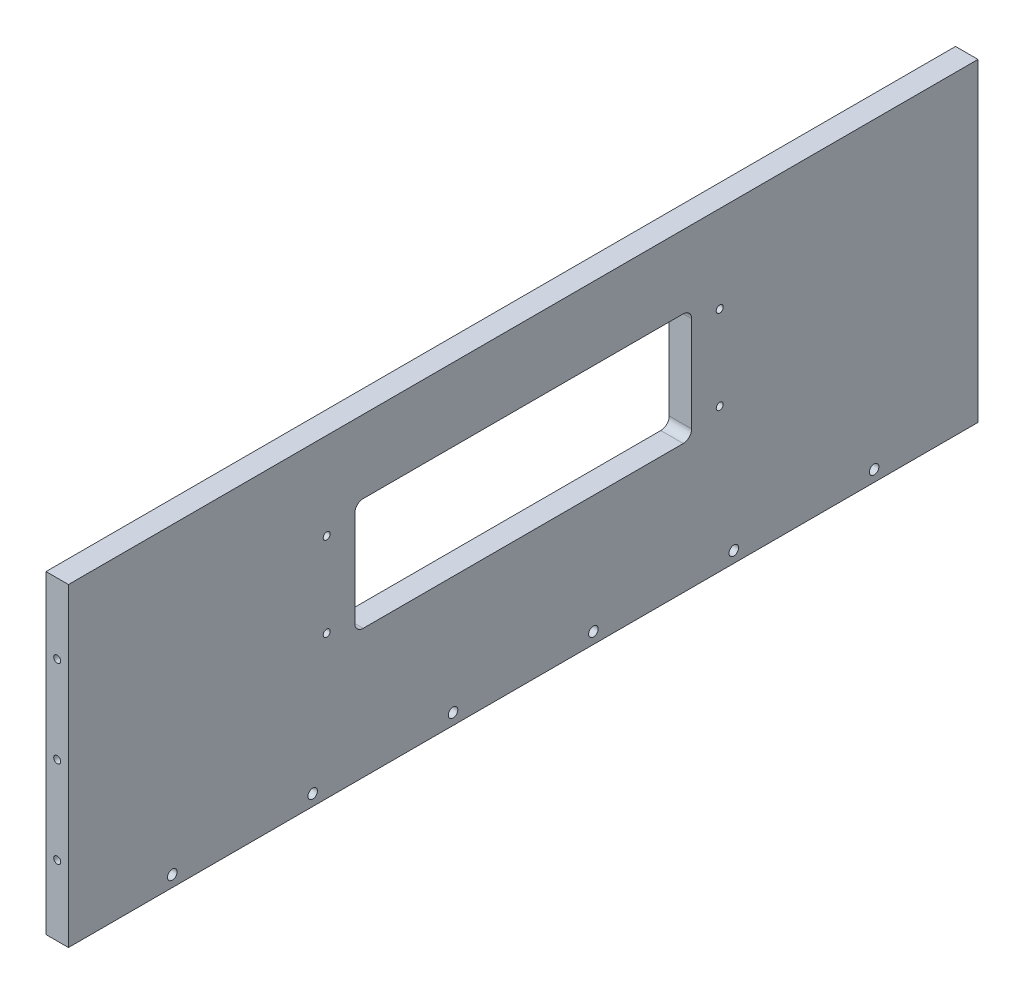
ISO-10303-21;
HEADER;
FILE_DESCRIPTION(('STEP AP214'),'2;1');
FILE_NAME('part.step','',(''),(''),'','','');
FILE_SCHEMA(('AUTOMOTIVE_DESIGN { 1 0 10303 214 1 1 1 1 }'));
ENDSEC;
DATA;
#1=APPLICATION_CONTEXT('core data for automotive mechanical design processes');
#2=APPLICATION_PROTOCOL_DEFINITION('international standard','automotive_design',2000,#1);
#3=PRODUCT_CONTEXT('',#1,'mechanical');
#4=PRODUCT('Part','Part','',(#3));
#5=PRODUCT_RELATED_PRODUCT_CATEGORY('part','',(#4));
#6=PRODUCT_DEFINITION_FORMATION('','',#4);
#7=PRODUCT_DEFINITION_CONTEXT('part definition',#1,'design');
#8=PRODUCT_DEFINITION('design','',#6,#7);
#9=PRODUCT_DEFINITION_SHAPE('','',#8);
#10=(LENGTH_UNIT() NAMED_UNIT(*) SI_UNIT(.MILLI.,.METRE.));
#11=(NAMED_UNIT(*) PLANE_ANGLE_UNIT() SI_UNIT($,.RADIAN.));
#12=(NAMED_UNIT(*) SI_UNIT($,.STERADIAN.) SOLID_ANGLE_UNIT());
#13=UNCERTAINTY_MEASURE_WITH_UNIT(LENGTH_MEASURE(1.E-05),#10,'distance_accuracy_value','');
#14=(GEOMETRIC_REPRESENTATION_CONTEXT(3) GLOBAL_UNCERTAINTY_ASSIGNED_CONTEXT((#13)) GLOBAL_UNIT_ASSIGNED_CONTEXT((#10,
#11,#12)) REPRESENTATION_CONTEXT('',''));
#15=CARTESIAN_POINT('',(0.,0.,0.));
#16=DIRECTION('',(0.,0.,1.));
#17=DIRECTION('',(1.,0.,0.));
#18=AXIS2_PLACEMENT_3D('',#15,#16,#17);
#19=CARTESIAN_POINT('',(8.,-56.,162.));
#20=DIRECTION('',(0.,0.,-1.));
#21=DIRECTION('',(-1.,0.,0.));
#22=AXIS2_PLACEMENT_3D('',#19,#20,#21);
#23=PLANE('',#22);
#24=CARTESIAN_POINT('',(4.00000000000006,31.,162.));
#25=DIRECTION('',(0.,0.,1.));
#26=DIRECTION('',(1.,0.,0.));
#27=AXIS2_PLACEMENT_3D('',#24,#25,#26);
#28=CIRCLE('',#27,1.24999999999999);
#29=CARTESIAN_POINT('',(5.25000000000005,31.,162.));
#30=VERTEX_POINT('',#29);
#31=EDGE_CURVE('E171',#30,#30,#28,.T.);
#32=ORIENTED_EDGE('',*,*,#31,.F.);
#33=EDGE_LOOP('',(#32));
#34=FACE_BOUND('',#33,.T.);
#35=CARTESIAN_POINT('',(4.00000000000006,0.,162.));
#36=DIRECTION('',(0.,0.,1.));
#37=DIRECTION('',(1.,0.,0.));
#38=AXIS2_PLACEMENT_3D('',#35,#36,#37);
#39=CIRCLE('',#38,1.24999999999999);
#40=CARTESIAN_POINT('',(5.25000000000005,0.,162.));
#41=VERTEX_POINT('',#40);
#42=EDGE_CURVE('E177',#41,#41,#39,.T.);
#43=ORIENTED_EDGE('',*,*,#42,.F.);
#44=EDGE_LOOP('',(#43));
#45=FACE_BOUND('',#44,.T.);
#46=CARTESIAN_POINT('',(4.00000000000006,-31.,162.));
#47=DIRECTION('',(0.,0.,1.));
#48=DIRECTION('',(1.,0.,0.));
#49=AXIS2_PLACEMENT_3D('',#46,#47,#48);
#50=CIRCLE('',#49,1.24999999999999);
#51=CARTESIAN_POINT('',(5.25000000000005,-31.,162.));
#52=VERTEX_POINT('',#51);
#53=EDGE_CURVE('E183',#52,#52,#50,.T.);
#54=ORIENTED_EDGE('',*,*,#53,.F.);
#55=EDGE_LOOP('',(#54));
#56=FACE_BOUND('',#55,.T.);
#57=DIRECTION('',(0.,-1.,0.));
#58=VECTOR('',#57,1.);
#59=CARTESIAN_POINT('',(0.,-56.,162.));
#60=LINE('',#59,#58);
#61=CARTESIAN_POINT('',(0.,56.,162.));
#62=VERTEX_POINT('',#61);
#63=CARTESIAN_POINT('',(0.,-56.,162.));
#64=VERTEX_POINT('',#63);
#65=EDGE_CURVE('E189',#62,#64,#60,.T.);
#66=ORIENTED_EDGE('',*,*,#65,.T.);
#67=DIRECTION('',(-1.,0.,0.));
#68=VECTOR('',#67,1.);
#69=CARTESIAN_POINT('',(8.,-56.,162.));
#70=LINE('',#69,#68);
#71=CARTESIAN_POINT('',(8.,-56.,162.));
#72=VERTEX_POINT('',#71);
#73=EDGE_CURVE('E216',#72,#64,#70,.T.);
#74=ORIENTED_EDGE('',*,*,#73,.F.);
#75=DIRECTION('',(0.,-1.,0.));
#76=VECTOR('',#75,1.);
#77=CARTESIAN_POINT('',(8.,-56.,162.));
#78=LINE('',#77,#76);
#79=CARTESIAN_POINT('',(8.,56.,162.));
#80=VERTEX_POINT('',#79);
#81=EDGE_CURVE('E190',#80,#72,#78,.T.);
#82=ORIENTED_EDGE('',*,*,#81,.F.);
#83=DIRECTION('',(-1.,0.,0.));
#84=VECTOR('',#83,1.);
#85=CARTESIAN_POINT('',(8.,56.,162.));
#86=LINE('',#85,#84);
#87=EDGE_CURVE('E200',#80,#62,#86,.T.);
#88=ORIENTED_EDGE('',*,*,#87,.T.);
#89=EDGE_LOOP('',(#66,#74,#82,#88));
#90=FACE_BOUND('',#89,.T.);
#91=ADVANCED_FACE('F37',(#34,#45,#56,#90),#23,.F.);
#92=CARTESIAN_POINT('',(8.,-56.,-162.));
#93=DIRECTION('',(0.,1.,0.));
#94=DIRECTION('',(0.,0.,1.));
#95=AXIS2_PLACEMENT_3D('',#92,#93,#94);
#96=PLANE('',#95);
#97=DIRECTION('',(0.,0.,-1.));
#98=VECTOR('',#97,1.);
#99=CARTESIAN_POINT('',(0.,-56.,-162.));
#100=LINE('',#99,#98);
#101=CARTESIAN_POINT('',(0.,-56.,-162.));
#102=VERTEX_POINT('',#101);
#103=EDGE_CURVE('E203',#64,#102,#100,.T.);
#104=ORIENTED_EDGE('',*,*,#103,.T.);
#105=DIRECTION('',(-1.,0.,0.));
#106=VECTOR('',#105,1.);
#107=CARTESIAN_POINT('',(8.,-56.,-162.));
#108=LINE('',#107,#106);
#109=CARTESIAN_POINT('',(8.,-56.,-162.));
#110=VERTEX_POINT('',#109);
#111=EDGE_CURVE('E213',#110,#102,#108,.T.);
#112=ORIENTED_EDGE('',*,*,#111,.F.);
#113=DIRECTION('',(0.,0.,-1.));
#114=VECTOR('',#113,1.);
#115=CARTESIAN_POINT('',(8.,-56.,-162.));
#116=LINE('',#115,#114);
#117=EDGE_CURVE('E193',#72,#110,#116,.T.);
#118=ORIENTED_EDGE('',*,*,#117,.F.);
#119=ORIENTED_EDGE('',*,*,#73,.T.);
#120=EDGE_LOOP('',(#104,#112,#118,#119));
#121=FACE_BOUND('',#120,.T.);
#122=ADVANCED_FACE('F368',(#121),#96,.F.);
#123=CARTESIAN_POINT('',(8.,-56.,-162.));
#124=DIRECTION('',(0.,0.,1.));
#125=DIRECTION('',(1.,0.,0.));
#126=AXIS2_PLACEMENT_3D('',#123,#124,#125);
#127=PLANE('',#126);
#128=CARTESIAN_POINT('',(4.00000000000006,31.,-162.));
#129=DIRECTION('',(0.,0.,-1.));
#130=DIRECTION('',(-1.,0.,0.));
#131=AXIS2_PLACEMENT_3D('',#128,#129,#130);
#132=CIRCLE('',#131,1.24999999999999);
#133=CARTESIAN_POINT('',(2.75000000000007,31.,-162.));
#134=VERTEX_POINT('',#133);
#135=EDGE_CURVE('E153',#134,#134,#132,.T.);
#136=ORIENTED_EDGE('',*,*,#135,.F.);
#137=EDGE_LOOP('',(#136));
#138=FACE_BOUND('',#137,.T.);
#139=CARTESIAN_POINT('',(4.00000000000006,0.,-162.));
#140=DIRECTION('',(0.,0.,-1.));
#141=DIRECTION('',(-1.,0.,0.));
#142=AXIS2_PLACEMENT_3D('',#139,#140,#141);
#143=CIRCLE('',#142,1.24999999999999);
#144=CARTESIAN_POINT('',(2.75000000000007,0.,-162.));
#145=VERTEX_POINT('',#144);
#146=EDGE_CURVE('E152',#145,#145,#143,.T.);
#147=ORIENTED_EDGE('',*,*,#146,.F.);
#148=EDGE_LOOP('',(#147));
#149=FACE_BOUND('',#148,.T.);
#150=CARTESIAN_POINT('',(4.00000000000006,-31.,-162.));
#151=DIRECTION('',(0.,0.,-1.));
#152=DIRECTION('',(-1.,0.,0.));
#153=AXIS2_PLACEMENT_3D('',#150,#151,#152);
#154=CIRCLE('',#153,1.24999999999999);
#155=CARTESIAN_POINT('',(2.75000000000007,-31.,-162.));
#156=VERTEX_POINT('',#155);
#157=EDGE_CURVE('E165',#156,#156,#154,.T.);
#158=ORIENTED_EDGE('',*,*,#157,.F.);
#159=EDGE_LOOP('',(#158));
#160=FACE_BOUND('',#159,.T.);
#161=DIRECTION('',(0.,1.,0.));
#162=VECTOR('',#161,1.);
#163=CARTESIAN_POINT('',(0.,-56.,-162.));
#164=LINE('',#163,#162);
#165=CARTESIAN_POINT('',(0.,56.,-162.));
#166=VERTEX_POINT('',#165);
#167=EDGE_CURVE('E205',#102,#166,#164,.T.);
#168=ORIENTED_EDGE('',*,*,#167,.T.);
#169=DIRECTION('',(-1.,0.,0.));
#170=VECTOR('',#169,1.);
#171=CARTESIAN_POINT('',(8.,56.,-162.));
#172=LINE('',#171,#170);
#173=CARTESIAN_POINT('',(8.,56.,-162.));
#174=VERTEX_POINT('',#173);
#175=EDGE_CURVE('E210',#174,#166,#172,.T.);
#176=ORIENTED_EDGE('',*,*,#175,.F.);
#177=DIRECTION('',(0.,1.,0.));
#178=VECTOR('',#177,1.);
#179=CARTESIAN_POINT('',(8.,-56.,-162.));
#180=LINE('',#179,#178);
#181=EDGE_CURVE('E196',#110,#174,#180,.T.);
#182=ORIENTED_EDGE('',*,*,#181,.F.);
#183=ORIENTED_EDGE('',*,*,#111,.T.);
#184=EDGE_LOOP('',(#168,#176,#182,#183));
#185=FACE_BOUND('',#184,.T.);
#186=ADVANCED_FACE('F365',(#138,#149,#160,#185),#127,.F.);
#187=CARTESIAN_POINT('',(8.,56.,-162.));
#188=DIRECTION('',(0.,-1.,0.));
#189=DIRECTION('',(0.,0.,-1.));
#190=AXIS2_PLACEMENT_3D('',#187,#188,#189);
#191=PLANE('',#190);
#192=DIRECTION('',(0.,0.,1.));
#193=VECTOR('',#192,1.);
#194=CARTESIAN_POINT('',(0.,56.,-162.));
#195=LINE('',#194,#193);
#196=EDGE_CURVE('E194',#166,#62,#195,.T.);
#197=ORIENTED_EDGE('',*,*,#196,.T.);
#198=ORIENTED_EDGE('',*,*,#87,.F.);
#199=DIRECTION('',(0.,0.,1.));
#200=VECTOR('',#199,1.);
#201=CARTESIAN_POINT('',(8.,56.,-162.));
#202=LINE('',#201,#200);
#203=EDGE_CURVE('E198',#174,#80,#202,.T.);
#204=ORIENTED_EDGE('',*,*,#203,.F.);
#205=ORIENTED_EDGE('',*,*,#175,.T.);
#206=EDGE_LOOP('',(#197,#198,#204,#205));
#207=FACE_BOUND('',#206,.T.);
#208=ADVANCED_FACE('F361',(#207),#191,.F.);
#209=CARTESIAN_POINT('',(8.,0.,0.));
#210=DIRECTION('',(1.,0.,0.));
#211=DIRECTION('',(0.,0.,-1.));
#212=AXIS2_PLACEMENT_3D('',#209,#210,#211);
#213=PLANE('',#212);
#214=CARTESIAN_POINT('',(8.,25.,-70.));
#215=DIRECTION('',(1.,0.,0.));
#216=DIRECTION('',(0.,0.,-1.));
#217=AXIS2_PLACEMENT_3D('',#214,#215,#216);
#218=CIRCLE('',#217,1.24999999999999);
#219=CARTESIAN_POINT('',(8.,25.,-71.25));
#220=VERTEX_POINT('',#219);
#221=EDGE_CURVE('E436',#220,#220,#218,.T.);
#222=ORIENTED_EDGE('',*,*,#221,.F.);
#223=EDGE_LOOP('',(#222));
#224=FACE_BOUND('',#223,.T.);
#225=CARTESIAN_POINT('',(8.,-5.,-70.));
#226=DIRECTION('',(1.,0.,0.));
#227=DIRECTION('',(0.,0.,-1.));
#228=AXIS2_PLACEMENT_3D('',#225,#226,#227);
#229=CIRCLE('',#228,1.24999999999999);
#230=CARTESIAN_POINT('',(8.,-5.,-71.25));
#231=VERTEX_POINT('',#230);
#232=EDGE_CURVE('E430',#231,#231,#229,.T.);
#233=ORIENTED_EDGE('',*,*,#232,.F.);
#234=EDGE_LOOP('',(#233));
#235=FACE_BOUND('',#234,.T.);
#236=CARTESIAN_POINT('',(8.,25.,70.));
#237=DIRECTION('',(1.,0.,0.));
#238=DIRECTION('',(0.,0.,-1.));
#239=AXIS2_PLACEMENT_3D('',#236,#237,#238);
#240=CIRCLE('',#239,1.24999999999999);
#241=CARTESIAN_POINT('',(8.,25.,68.75));
#242=VERTEX_POINT('',#241);
#243=EDGE_CURVE('E424',#242,#242,#240,.T.);
#244=ORIENTED_EDGE('',*,*,#243,.F.);
#245=EDGE_LOOP('',(#244));
#246=FACE_BOUND('',#245,.T.);
#247=CARTESIAN_POINT('',(8.,-5.,70.));
#248=DIRECTION('',(1.,0.,0.));
#249=DIRECTION('',(0.,0.,-1.));
#250=AXIS2_PLACEMENT_3D('',#247,#248,#249);
#251=CIRCLE('',#250,1.24999999999999);
#252=CARTESIAN_POINT('',(8.,-5.,68.75));
#253=VERTEX_POINT('',#252);
#254=EDGE_CURVE('E418',#253,#253,#251,.T.);
#255=ORIENTED_EDGE('',*,*,#254,.F.);
#256=EDGE_LOOP('',(#255));
#257=FACE_BOUND('',#256,.T.);
#258=DIRECTION('',(0.,-1.,0.));
#259=VECTOR('',#258,1.);
#260=CARTESIAN_POINT('',(8.,-10.,60.));
#261=LINE('',#260,#259);
#262=CARTESIAN_POINT('',(8.,27.,60.));
#263=VERTEX_POINT('',#262);
#264=CARTESIAN_POINT('',(8.,-7.,60.));
#265=VERTEX_POINT('',#264);
#266=EDGE_CURVE('E307',#263,#265,#261,.T.);
#267=ORIENTED_EDGE('',*,*,#266,.F.);
#268=CARTESIAN_POINT('',(8.,27.,57.));
#269=DIRECTION('',(1.,0.,0.));
#270=DIRECTION('',(0.,0.,-1.));
#271=AXIS2_PLACEMENT_3D('',#268,#269,#270);
#272=CIRCLE('',#271,3.);
#273=CARTESIAN_POINT('',(8.,30.,57.));
#274=VERTEX_POINT('',#273);
#275=EDGE_CURVE('E274',#263,#274,#272,.F.);
#276=ORIENTED_EDGE('',*,*,#275,.T.);
#277=DIRECTION('',(0.,0.,1.));
#278=VECTOR('',#277,1.);
#279=CARTESIAN_POINT('',(8.,30.,-60.));
#280=LINE('',#279,#278);
#281=CARTESIAN_POINT('',(8.,30.,-57.));
#282=VERTEX_POINT('',#281);
#283=EDGE_CURVE('E285',#282,#274,#280,.T.);
#284=ORIENTED_EDGE('',*,*,#283,.F.);
#285=CARTESIAN_POINT('',(8.,27.,-57.));
#286=DIRECTION('',(1.,0.,0.));
#287=DIRECTION('',(0.,0.,-1.));
#288=AXIS2_PLACEMENT_3D('',#285,#286,#287);
#289=CIRCLE('',#288,3.);
#290=CARTESIAN_POINT('',(8.,27.,-60.));
#291=VERTEX_POINT('',#290);
#292=EDGE_CURVE('E45',#282,#291,#289,.F.);
#293=ORIENTED_EDGE('',*,*,#292,.T.);
#294=DIRECTION('',(0.,1.,0.));
#295=VECTOR('',#294,1.);
#296=CARTESIAN_POINT('',(8.,-9.99999999999999,-60.));
#297=LINE('',#296,#295);
#298=CARTESIAN_POINT('',(8.,-6.99999999999999,-60.));
#299=VERTEX_POINT('',#298);
#300=EDGE_CURVE('E284',#299,#291,#297,.T.);
#301=ORIENTED_EDGE('',*,*,#300,.F.);
#302=CARTESIAN_POINT('',(8.,-6.99999999999999,-57.));
#303=DIRECTION('',(1.,0.,0.));
#304=DIRECTION('',(0.,0.,-1.));
#305=AXIS2_PLACEMENT_3D('',#302,#303,#304);
#306=CIRCLE('',#305,3.);
#307=CARTESIAN_POINT('',(8.,-9.99999999999999,-57.));
#308=VERTEX_POINT('',#307);
#309=EDGE_CURVE('E266',#299,#308,#306,.F.);
#310=ORIENTED_EDGE('',*,*,#309,.T.);
#311=DIRECTION('',(0.,0.,-1.));
#312=VECTOR('',#311,1.);
#313=CARTESIAN_POINT('',(8.,-9.99999999999999,-60.));
#314=LINE('',#313,#312);
#315=CARTESIAN_POINT('',(8.,-10.,57.));
#316=VERTEX_POINT('',#315);
#317=EDGE_CURVE('E293',#316,#308,#314,.T.);
#318=ORIENTED_EDGE('',*,*,#317,.F.);
#319=CARTESIAN_POINT('',(8.,-7.,57.));
#320=DIRECTION('',(1.,0.,0.));
#321=DIRECTION('',(0.,0.,-1.));
#322=AXIS2_PLACEMENT_3D('',#319,#320,#321);
#323=CIRCLE('',#322,3.);
#324=EDGE_CURVE('E270',#316,#265,#323,.F.);
#325=ORIENTED_EDGE('',*,*,#324,.T.);
#326=EDGE_LOOP('',(#267,#276,#284,#293,#301,#310,#318,#325));
#327=FACE_BOUND('',#326,.T.);
#328=CARTESIAN_POINT('',(8.,-52.,-125.));
#329=DIRECTION('',(1.,0.,0.));
#330=DIRECTION('',(0.,0.,-1.));
#331=AXIS2_PLACEMENT_3D('',#328,#329,#330);
#332=CIRCLE('',#331,1.7);
#333=CARTESIAN_POINT('',(8.,-52.,-126.7));
#334=VERTEX_POINT('',#333);
#335=EDGE_CURVE('E243',#334,#334,#332,.T.);
#336=ORIENTED_EDGE('',*,*,#335,.F.);
#337=EDGE_LOOP('',(#336));
#338=FACE_BOUND('',#337,.T.);
#339=CARTESIAN_POINT('',(8.,-52.,-75.));
#340=DIRECTION('',(1.,0.,0.));
#341=DIRECTION('',(0.,0.,-1.));
#342=AXIS2_PLACEMENT_3D('',#339,#340,#341);
#343=CIRCLE('',#342,1.7);
#344=CARTESIAN_POINT('',(8.,-52.,-76.7));
#345=VERTEX_POINT('',#344);
#346=EDGE_CURVE('E238',#345,#345,#343,.T.);
#347=ORIENTED_EDGE('',*,*,#346,.F.);
#348=EDGE_LOOP('',(#347));
#349=FACE_BOUND('',#348,.T.);
#350=CARTESIAN_POINT('',(8.,-52.,-25.));
#351=DIRECTION('',(1.,0.,0.));
#352=DIRECTION('',(0.,0.,-1.));
#353=AXIS2_PLACEMENT_3D('',#350,#351,#352);
#354=CIRCLE('',#353,1.7);
#355=CARTESIAN_POINT('',(8.,-52.,-26.7));
#356=VERTEX_POINT('',#355);
#357=EDGE_CURVE('E233',#356,#356,#354,.T.);
#358=ORIENTED_EDGE('',*,*,#357,.F.);
#359=EDGE_LOOP('',(#358));
#360=FACE_BOUND('',#359,.T.);
#361=CARTESIAN_POINT('',(8.,-52.,25.));
#362=DIRECTION('',(1.,0.,0.));
#363=DIRECTION('',(0.,0.,-1.));
#364=AXIS2_PLACEMENT_3D('',#361,#362,#363);
#365=CIRCLE('',#364,1.7);
#366=CARTESIAN_POINT('',(8.,-52.,23.3));
#367=VERTEX_POINT('',#366);
#368=EDGE_CURVE('E228',#367,#367,#365,.T.);
#369=ORIENTED_EDGE('',*,*,#368,.F.);
#370=EDGE_LOOP('',(#369));
#371=FACE_BOUND('',#370,.T.);
#372=CARTESIAN_POINT('',(8.,-51.9999999999999,75.));
#373=DIRECTION('',(1.,0.,0.));
#374=DIRECTION('',(0.,0.,-1.));
#375=AXIS2_PLACEMENT_3D('',#372,#373,#374);
#376=CIRCLE('',#375,1.7);
#377=CARTESIAN_POINT('',(8.,-51.9999999999999,73.3));
#378=VERTEX_POINT('',#377);
#379=EDGE_CURVE('E223',#378,#378,#376,.T.);
#380=ORIENTED_EDGE('',*,*,#379,.F.);
#381=EDGE_LOOP('',(#380));
#382=FACE_BOUND('',#381,.T.);
#383=CARTESIAN_POINT('',(8.,-51.9999999999999,125.));
#384=DIRECTION('',(1.,0.,0.));
#385=DIRECTION('',(0.,0.,-1.));
#386=AXIS2_PLACEMENT_3D('',#383,#384,#385);
#387=CIRCLE('',#386,1.7);
#388=CARTESIAN_POINT('',(8.,-51.9999999999999,123.3));
#389=VERTEX_POINT('',#388);
#390=EDGE_CURVE('E159',#389,#389,#387,.T.);
#391=ORIENTED_EDGE('',*,*,#390,.F.);
#392=EDGE_LOOP('',(#391));
#393=FACE_BOUND('',#392,.T.);
#394=ORIENTED_EDGE('',*,*,#81,.T.);
#395=ORIENTED_EDGE('',*,*,#117,.T.);
#396=ORIENTED_EDGE('',*,*,#181,.T.);
#397=ORIENTED_EDGE('',*,*,#203,.T.);
#398=EDGE_LOOP('',(#394,#395,#396,#397));
#399=FACE_BOUND('',#398,.T.);
#400=ADVANCED_FACE('F282',(#224,#235,#246,#257,#327,#338,#349,#360,#371,#382,#393,#399),#213,.T.);
#401=CARTESIAN_POINT('',(0.,0.,0.));
#402=DIRECTION('',(1.,0.,0.));
#403=DIRECTION('',(0.,0.,-1.));
#404=AXIS2_PLACEMENT_3D('',#401,#402,#403);
#405=PLANE('',#404);
#406=CARTESIAN_POINT('',(0.,25.,-70.));
#407=DIRECTION('',(1.,0.,0.));
#408=DIRECTION('',(0.,0.,-1.));
#409=AXIS2_PLACEMENT_3D('',#406,#407,#408);
#410=CIRCLE('',#409,1.25);
#411=CARTESIAN_POINT('',(0.,25.,-71.25));
#412=VERTEX_POINT('',#411);
#413=EDGE_CURVE('E433',#412,#412,#410,.T.);
#414=ORIENTED_EDGE('',*,*,#413,.T.);
#415=EDGE_LOOP('',(#414));
#416=FACE_BOUND('',#415,.T.);
#417=CARTESIAN_POINT('',(0.,-5.,-70.));
#418=DIRECTION('',(1.,0.,0.));
#419=DIRECTION('',(0.,0.,-1.));
#420=AXIS2_PLACEMENT_3D('',#417,#418,#419);
#421=CIRCLE('',#420,1.25);
#422=CARTESIAN_POINT('',(0.,-5.,-71.25));
#423=VERTEX_POINT('',#422);
#424=EDGE_CURVE('E427',#423,#423,#421,.T.);
#425=ORIENTED_EDGE('',*,*,#424,.T.);
#426=EDGE_LOOP('',(#425));
#427=FACE_BOUND('',#426,.T.);
#428=CARTESIAN_POINT('',(0.,25.,70.));
#429=DIRECTION('',(1.,0.,0.));
#430=DIRECTION('',(0.,0.,-1.));
#431=AXIS2_PLACEMENT_3D('',#428,#429,#430);
#432=CIRCLE('',#431,1.25);
#433=CARTESIAN_POINT('',(0.,25.,68.75));
#434=VERTEX_POINT('',#433);
#435=EDGE_CURVE('E421',#434,#434,#432,.T.);
#436=ORIENTED_EDGE('',*,*,#435,.T.);
#437=EDGE_LOOP('',(#436));
#438=FACE_BOUND('',#437,.T.);
#439=CARTESIAN_POINT('',(0.,-5.,70.));
#440=DIRECTION('',(1.,0.,0.));
#441=DIRECTION('',(0.,0.,-1.));
#442=AXIS2_PLACEMENT_3D('',#439,#440,#441);
#443=CIRCLE('',#442,1.25);
#444=CARTESIAN_POINT('',(0.,-5.,68.75));
#445=VERTEX_POINT('',#444);
#446=EDGE_CURVE('E310',#445,#445,#443,.T.);
#447=ORIENTED_EDGE('',*,*,#446,.T.);
#448=EDGE_LOOP('',(#447));
#449=FACE_BOUND('',#448,.T.);
#450=DIRECTION('',(0.,1.,0.));
#451=VECTOR('',#450,1.);
#452=CARTESIAN_POINT('',(0.,-9.99999999999999,-60.));
#453=LINE('',#452,#451);
#454=CARTESIAN_POINT('',(0.,-6.99999999999999,-60.));
#455=VERTEX_POINT('',#454);
#456=CARTESIAN_POINT('',(0.,27.,-60.));
#457=VERTEX_POINT('',#456);
#458=EDGE_CURVE('E299',#455,#457,#453,.T.);
#459=ORIENTED_EDGE('',*,*,#458,.T.);
#460=CARTESIAN_POINT('',(0.,27.,-57.));
#461=DIRECTION('',(1.,0.,0.));
#462=DIRECTION('',(0.,0.,-1.));
#463=AXIS2_PLACEMENT_3D('',#460,#461,#462);
#464=CIRCLE('',#463,3.);
#465=CARTESIAN_POINT('',(0.,30.,-57.));
#466=VERTEX_POINT('',#465);
#467=EDGE_CURVE('E11',#457,#466,#464,.T.);
#468=ORIENTED_EDGE('',*,*,#467,.T.);
#469=DIRECTION('',(0.,0.,1.));
#470=VECTOR('',#469,1.);
#471=CARTESIAN_POINT('',(0.,30.,-60.));
#472=LINE('',#471,#470);
#473=CARTESIAN_POINT('',(0.,30.,57.));
#474=VERTEX_POINT('',#473);
#475=EDGE_CURVE('E296',#466,#474,#472,.T.);
#476=ORIENTED_EDGE('',*,*,#475,.T.);
#477=CARTESIAN_POINT('',(0.,27.,57.));
#478=DIRECTION('',(1.,0.,0.));
#479=DIRECTION('',(0.,0.,-1.));
#480=AXIS2_PLACEMENT_3D('',#477,#478,#479);
#481=CIRCLE('',#480,3.);
#482=CARTESIAN_POINT('',(0.,27.,60.));
#483=VERTEX_POINT('',#482);
#484=EDGE_CURVE('E276',#474,#483,#481,.T.);
#485=ORIENTED_EDGE('',*,*,#484,.T.);
#486=DIRECTION('',(0.,-1.,0.));
#487=VECTOR('',#486,1.);
#488=CARTESIAN_POINT('',(0.,-10.,60.));
#489=LINE('',#488,#487);
#490=CARTESIAN_POINT('',(0.,-7.,60.));
#491=VERTEX_POINT('',#490);
#492=EDGE_CURVE('E313',#483,#491,#489,.T.);
#493=ORIENTED_EDGE('',*,*,#492,.T.);
#494=CARTESIAN_POINT('',(0.,-7.,57.));
#495=DIRECTION('',(1.,0.,0.));
#496=DIRECTION('',(0.,0.,-1.));
#497=AXIS2_PLACEMENT_3D('',#494,#495,#496);
#498=CIRCLE('',#497,3.);
#499=CARTESIAN_POINT('',(0.,-10.,57.));
#500=VERTEX_POINT('',#499);
#501=EDGE_CURVE('E272',#491,#500,#498,.T.);
#502=ORIENTED_EDGE('',*,*,#501,.T.);
#503=DIRECTION('',(0.,0.,-1.));
#504=VECTOR('',#503,1.);
#505=CARTESIAN_POINT('',(0.,-9.99999999999999,-60.));
#506=LINE('',#505,#504);
#507=CARTESIAN_POINT('',(0.,-9.99999999999999,-57.));
#508=VERTEX_POINT('',#507);
#509=EDGE_CURVE('E303',#500,#508,#506,.T.);
#510=ORIENTED_EDGE('',*,*,#509,.T.);
#511=CARTESIAN_POINT('',(0.,-6.99999999999999,-57.));
#512=DIRECTION('',(1.,0.,0.));
#513=DIRECTION('',(0.,0.,-1.));
#514=AXIS2_PLACEMENT_3D('',#511,#512,#513);
#515=CIRCLE('',#514,3.);
#516=EDGE_CURVE('E268',#508,#455,#515,.T.);
#517=ORIENTED_EDGE('',*,*,#516,.T.);
#518=EDGE_LOOP('',(#459,#468,#476,#485,#493,#502,#510,#517));
#519=FACE_BOUND('',#518,.T.);
#520=CARTESIAN_POINT('',(0.,-52.,-125.));
#521=DIRECTION('',(-1.,0.,0.));
#522=DIRECTION('',(0.,0.,1.));
#523=AXIS2_PLACEMENT_3D('',#520,#521,#522);
#524=CIRCLE('',#523,3.15);
#525=CARTESIAN_POINT('',(0.,-52.,-121.85));
#526=VERTEX_POINT('',#525);
#527=EDGE_CURVE('E298',#526,#526,#524,.T.);
#528=ORIENTED_EDGE('',*,*,#527,.F.);
#529=EDGE_LOOP('',(#528));
#530=FACE_BOUND('',#529,.T.);
#531=CARTESIAN_POINT('',(0.,-52.,-75.));
#532=DIRECTION('',(-1.,0.,0.));
#533=DIRECTION('',(0.,0.,1.));
#534=AXIS2_PLACEMENT_3D('',#531,#532,#533);
#535=CIRCLE('',#534,3.15);
#536=CARTESIAN_POINT('',(0.,-52.,-71.85));
#537=VERTEX_POINT('',#536);
#538=EDGE_CURVE('E246',#537,#537,#535,.T.);
#539=ORIENTED_EDGE('',*,*,#538,.F.);
#540=EDGE_LOOP('',(#539));
#541=FACE_BOUND('',#540,.T.);
#542=CARTESIAN_POINT('',(0.,-52.,-25.));
#543=DIRECTION('',(-1.,0.,0.));
#544=DIRECTION('',(0.,0.,1.));
#545=AXIS2_PLACEMENT_3D('',#542,#543,#544);
#546=CIRCLE('',#545,3.15);
#547=CARTESIAN_POINT('',(0.,-52.,-21.85));
#548=VERTEX_POINT('',#547);
#549=EDGE_CURVE('E241',#548,#548,#546,.T.);
#550=ORIENTED_EDGE('',*,*,#549,.F.);
#551=EDGE_LOOP('',(#550));
#552=FACE_BOUND('',#551,.T.);
#553=CARTESIAN_POINT('',(0.,-52.,25.));
#554=DIRECTION('',(-1.,0.,0.));
#555=DIRECTION('',(0.,0.,1.));
#556=AXIS2_PLACEMENT_3D('',#553,#554,#555);
#557=CIRCLE('',#556,3.15);
#558=CARTESIAN_POINT('',(0.,-52.,28.15));
#559=VERTEX_POINT('',#558);
#560=EDGE_CURVE('E236',#559,#559,#557,.T.);
#561=ORIENTED_EDGE('',*,*,#560,.F.);
#562=EDGE_LOOP('',(#561));
#563=FACE_BOUND('',#562,.T.);
#564=CARTESIAN_POINT('',(0.,-51.9999999999999,75.));
#565=DIRECTION('',(-1.,0.,0.));
#566=DIRECTION('',(0.,0.,1.));
#567=AXIS2_PLACEMENT_3D('',#564,#565,#566);
#568=CIRCLE('',#567,3.15);
#569=CARTESIAN_POINT('',(0.,-51.9999999999999,78.15));
#570=VERTEX_POINT('',#569);
#571=EDGE_CURVE('E231',#570,#570,#568,.T.);
#572=ORIENTED_EDGE('',*,*,#571,.F.);
#573=EDGE_LOOP('',(#572));
#574=FACE_BOUND('',#573,.T.);
#575=CARTESIAN_POINT('',(0.,-51.9999999999999,125.));
#576=DIRECTION('',(-1.,0.,0.));
#577=DIRECTION('',(0.,0.,1.));
#578=AXIS2_PLACEMENT_3D('',#575,#576,#577);
#579=CIRCLE('',#578,3.15);
#580=CARTESIAN_POINT('',(0.,-51.9999999999999,128.15));
#581=VERTEX_POINT('',#580);
#582=EDGE_CURVE('E226',#581,#581,#579,.T.);
#583=ORIENTED_EDGE('',*,*,#582,.F.);
#584=EDGE_LOOP('',(#583));
#585=FACE_BOUND('',#584,.T.);
#586=ORIENTED_EDGE('',*,*,#65,.F.);
#587=ORIENTED_EDGE('',*,*,#196,.F.);
#588=ORIENTED_EDGE('',*,*,#167,.F.);
#589=ORIENTED_EDGE('',*,*,#103,.F.);
#590=EDGE_LOOP('',(#586,#587,#588,#589));
#591=FACE_BOUND('',#590,.T.);
#592=ADVANCED_FACE('F346',(#416,#427,#438,#449,#519,#530,#541,#552,#563,#574,#585,#591),#405,.F.);
#593=CARTESIAN_POINT('',(4.00000000000006,-31.,150.5));
#594=DIRECTION('',(0.,0.,1.));
#595=DIRECTION('',(1.,0.,0.));
#596=AXIS2_PLACEMENT_3D('',#593,#594,#595);
#597=CONICAL_SURFACE('',#596,1.24999999999999,1.02974425867665);
#598=CARTESIAN_POINT('',(4.00000000000006,-31.,149.748924226216));
#599=VERTEX_POINT('',#598);
#600=VERTEX_LOOP('',#599);
#601=FACE_BOUND('',#600,.T.);
#602=CARTESIAN_POINT('',(4.00000000000006,-31.,150.5));
#603=DIRECTION('',(0.,0.,1.));
#604=DIRECTION('',(1.,0.,0.));
#605=AXIS2_PLACEMENT_3D('',#602,#603,#604);
#606=CIRCLE('',#605,1.24999999999999);
#607=CARTESIAN_POINT('',(5.25000000000005,-31.,150.5));
#608=VERTEX_POINT('',#607);
#609=EDGE_CURVE('E186',#608,#608,#606,.T.);
#610=ORIENTED_EDGE('',*,*,#609,.T.);
#611=EDGE_LOOP('',(#610));
#612=FACE_BOUND('',#611,.T.);
#613=ADVANCED_FACE('F349',(#601,#612),#597,.F.);
#614=CARTESIAN_POINT('',(4.00000000000006,-31.,162.));
#615=DIRECTION('',(0.,0.,1.));
#616=DIRECTION('',(1.,0.,0.));
#617=AXIS2_PLACEMENT_3D('',#614,#615,#616);
#618=CYLINDRICAL_SURFACE('',#617,1.24999999999999);
#619=ORIENTED_EDGE('',*,*,#609,.F.);
#620=EDGE_LOOP('',(#619));
#621=FACE_BOUND('',#620,.T.);
#622=ORIENTED_EDGE('',*,*,#53,.T.);
#623=EDGE_LOOP('',(#622));
#624=FACE_BOUND('',#623,.T.);
#625=ADVANCED_FACE('F542',(#621,#624),#618,.F.);
#626=CARTESIAN_POINT('',(4.00000000000006,0.,150.5));
#627=DIRECTION('',(0.,0.,1.));
#628=DIRECTION('',(1.,0.,0.));
#629=AXIS2_PLACEMENT_3D('',#626,#627,#628);
#630=CONICAL_SURFACE('',#629,1.24999999999999,1.02974425867665);
#631=CARTESIAN_POINT('',(4.00000000000006,0.,149.748924226216));
#632=VERTEX_POINT('',#631);
#633=VERTEX_LOOP('',#632);
#634=FACE_BOUND('',#633,.T.);
#635=CARTESIAN_POINT('',(4.00000000000006,0.,150.5));
#636=DIRECTION('',(0.,0.,1.));
#637=DIRECTION('',(1.,0.,0.));
#638=AXIS2_PLACEMENT_3D('',#635,#636,#637);
#639=CIRCLE('',#638,1.24999999999999);
#640=CARTESIAN_POINT('',(5.25000000000005,0.,150.5));
#641=VERTEX_POINT('',#640);
#642=EDGE_CURVE('E180',#641,#641,#639,.T.);
#643=ORIENTED_EDGE('',*,*,#642,.T.);
#644=EDGE_LOOP('',(#643));
#645=FACE_BOUND('',#644,.T.);
#646=ADVANCED_FACE('F538',(#634,#645),#630,.F.);
#647=CARTESIAN_POINT('',(4.00000000000006,0.,162.));
#648=DIRECTION('',(0.,0.,1.));
#649=DIRECTION('',(1.,0.,0.));
#650=AXIS2_PLACEMENT_3D('',#647,#648,#649);
#651=CYLINDRICAL_SURFACE('',#650,1.24999999999999);
#652=ORIENTED_EDGE('',*,*,#642,.F.);
#653=EDGE_LOOP('',(#652));
#654=FACE_BOUND('',#653,.T.);
#655=ORIENTED_EDGE('',*,*,#42,.T.);
#656=EDGE_LOOP('',(#655));
#657=FACE_BOUND('',#656,.T.);
#658=ADVANCED_FACE('F534',(#654,#657),#651,.F.);
#659=CARTESIAN_POINT('',(4.00000000000006,31.,150.5));
#660=DIRECTION('',(0.,0.,1.));
#661=DIRECTION('',(1.,0.,0.));
#662=AXIS2_PLACEMENT_3D('',#659,#660,#661);
#663=CONICAL_SURFACE('',#662,1.24999999999999,1.02974425867665);
#664=CARTESIAN_POINT('',(4.00000000000006,31.,149.748924226216));
#665=VERTEX_POINT('',#664);
#666=VERTEX_LOOP('',#665);
#667=FACE_BOUND('',#666,.T.);
#668=CARTESIAN_POINT('',(4.00000000000006,31.,150.5));
#669=DIRECTION('',(0.,0.,1.));
#670=DIRECTION('',(1.,0.,0.));
#671=AXIS2_PLACEMENT_3D('',#668,#669,#670);
#672=CIRCLE('',#671,1.24999999999999);
#673=CARTESIAN_POINT('',(5.25000000000005,31.,150.5));
#674=VERTEX_POINT('',#673);
#675=EDGE_CURVE('E174',#674,#674,#672,.T.);
#676=ORIENTED_EDGE('',*,*,#675,.T.);
#677=EDGE_LOOP('',(#676));
#678=FACE_BOUND('',#677,.T.);
#679=ADVANCED_FACE('F530',(#667,#678),#663,.F.);
#680=CARTESIAN_POINT('',(4.00000000000006,31.,162.));
#681=DIRECTION('',(0.,0.,1.));
#682=DIRECTION('',(1.,0.,0.));
#683=AXIS2_PLACEMENT_3D('',#680,#681,#682);
#684=CYLINDRICAL_SURFACE('',#683,1.24999999999999);
#685=ORIENTED_EDGE('',*,*,#675,.F.);
#686=EDGE_LOOP('',(#685));
#687=FACE_BOUND('',#686,.T.);
#688=ORIENTED_EDGE('',*,*,#31,.T.);
#689=EDGE_LOOP('',(#688));
#690=FACE_BOUND('',#689,.T.);
#691=ADVANCED_FACE('F526',(#687,#690),#684,.F.);
#692=CARTESIAN_POINT('',(4.00000000000006,-31.,-150.5));
#693=DIRECTION('',(0.,0.,-1.));
#694=DIRECTION('',(-1.,0.,0.));
#695=AXIS2_PLACEMENT_3D('',#692,#693,#694);
#696=CONICAL_SURFACE('',#695,1.24999999999999,1.02974425867665);
#697=CARTESIAN_POINT('',(4.00000000000006,-31.,-149.748924226216));
#698=VERTEX_POINT('',#697);
#699=VERTEX_LOOP('',#698);
#700=FACE_BOUND('',#699,.T.);
#701=CARTESIAN_POINT('',(4.00000000000006,-31.,-150.5));
#702=DIRECTION('',(0.,0.,-1.));
#703=DIRECTION('',(-1.,0.,0.));
#704=AXIS2_PLACEMENT_3D('',#701,#702,#703);
#705=CIRCLE('',#704,1.24999999999999);
#706=CARTESIAN_POINT('',(2.75000000000007,-31.,-150.5));
#707=VERTEX_POINT('',#706);
#708=EDGE_CURVE('E168',#707,#707,#705,.T.);
#709=ORIENTED_EDGE('',*,*,#708,.T.);
#710=EDGE_LOOP('',(#709));
#711=FACE_BOUND('',#710,.T.);
#712=ADVANCED_FACE('F522',(#700,#711),#696,.F.);
#713=CARTESIAN_POINT('',(4.00000000000006,-31.,-162.));
#714=DIRECTION('',(0.,0.,-1.));
#715=DIRECTION('',(-1.,0.,0.));
#716=AXIS2_PLACEMENT_3D('',#713,#714,#715);
#717=CYLINDRICAL_SURFACE('',#716,1.24999999999999);
#718=ORIENTED_EDGE('',*,*,#708,.F.);
#719=EDGE_LOOP('',(#718));
#720=FACE_BOUND('',#719,.T.);
#721=ORIENTED_EDGE('',*,*,#157,.T.);
#722=EDGE_LOOP('',(#721));
#723=FACE_BOUND('',#722,.T.);
#724=ADVANCED_FACE('F518',(#720,#723),#717,.F.);
#725=CARTESIAN_POINT('',(4.00000000000006,0.,-150.5));
#726=DIRECTION('',(0.,0.,-1.));
#727=DIRECTION('',(-1.,0.,0.));
#728=AXIS2_PLACEMENT_3D('',#725,#726,#727);
#729=CONICAL_SURFACE('',#728,1.24999999999999,1.02974425867665);
#730=CARTESIAN_POINT('',(4.00000000000006,0.,-149.748924226216));
#731=VERTEX_POINT('',#730);
#732=VERTEX_LOOP('',#731);
#733=FACE_BOUND('',#732,.T.);
#734=CARTESIAN_POINT('',(4.00000000000006,0.,-150.5));
#735=DIRECTION('',(0.,0.,-1.));
#736=DIRECTION('',(-1.,0.,0.));
#737=AXIS2_PLACEMENT_3D('',#734,#735,#736);
#738=CIRCLE('',#737,1.24999999999999);
#739=CARTESIAN_POINT('',(2.75000000000007,0.,-150.5));
#740=VERTEX_POINT('',#739);
#741=EDGE_CURVE('E156',#740,#740,#738,.T.);
#742=ORIENTED_EDGE('',*,*,#741,.T.);
#743=EDGE_LOOP('',(#742));
#744=FACE_BOUND('',#743,.T.);
#745=ADVANCED_FACE('F514',(#733,#744),#729,.F.);
#746=CARTESIAN_POINT('',(4.00000000000006,0.,-162.));
#747=DIRECTION('',(0.,0.,-1.));
#748=DIRECTION('',(-1.,0.,0.));
#749=AXIS2_PLACEMENT_3D('',#746,#747,#748);
#750=CYLINDRICAL_SURFACE('',#749,1.24999999999999);
#751=ORIENTED_EDGE('',*,*,#741,.F.);
#752=EDGE_LOOP('',(#751));
#753=FACE_BOUND('',#752,.T.);
#754=ORIENTED_EDGE('',*,*,#146,.T.);
#755=EDGE_LOOP('',(#754));
#756=FACE_BOUND('',#755,.T.);
#757=ADVANCED_FACE('F146',(#753,#756),#750,.F.);
#758=CARTESIAN_POINT('',(4.00000000000006,31.,-150.5));
#759=DIRECTION('',(0.,0.,-1.));
#760=DIRECTION('',(-1.,0.,0.));
#761=AXIS2_PLACEMENT_3D('',#758,#759,#760);
#762=CONICAL_SURFACE('',#761,1.24999999999999,1.02974425867665);
#763=CARTESIAN_POINT('',(4.00000000000006,31.,-149.748924226216));
#764=VERTEX_POINT('',#763);
#765=VERTEX_LOOP('',#764);
#766=FACE_BOUND('',#765,.T.);
#767=CARTESIAN_POINT('',(4.00000000000006,31.,-150.5));
#768=DIRECTION('',(0.,0.,-1.));
#769=DIRECTION('',(-1.,0.,0.));
#770=AXIS2_PLACEMENT_3D('',#767,#768,#769);
#771=CIRCLE('',#770,1.24999999999999);
#772=CARTESIAN_POINT('',(2.75000000000007,31.,-150.5));
#773=VERTEX_POINT('',#772);
#774=EDGE_CURVE('E150',#773,#773,#771,.T.);
#775=ORIENTED_EDGE('',*,*,#774,.T.);
#776=EDGE_LOOP('',(#775));
#777=FACE_BOUND('',#776,.T.);
#778=ADVANCED_FACE('F142',(#766,#777),#762,.F.);
#779=CARTESIAN_POINT('',(4.00000000000006,31.,-162.));
#780=DIRECTION('',(0.,0.,-1.));
#781=DIRECTION('',(-1.,0.,0.));
#782=AXIS2_PLACEMENT_3D('',#779,#780,#781);
#783=CYLINDRICAL_SURFACE('',#782,1.24999999999999);
#784=ORIENTED_EDGE('',*,*,#774,.F.);
#785=EDGE_LOOP('',(#784));
#786=FACE_BOUND('',#785,.T.);
#787=ORIENTED_EDGE('',*,*,#135,.T.);
#788=EDGE_LOOP('',(#787));
#789=FACE_BOUND('',#788,.T.);
#790=ADVANCED_FACE('F145',(#786,#789),#783,.F.);
#791=CARTESIAN_POINT('',(0.,-51.9999999999999,125.));
#792=DIRECTION('',(-1.,0.,0.));
#793=DIRECTION('',(0.,0.,1.));
#794=AXIS2_PLACEMENT_3D('',#791,#792,#793);
#795=CYLINDRICAL_SURFACE('',#794,1.7);
#796=ORIENTED_EDGE('',*,*,#390,.T.);
#797=EDGE_LOOP('',(#796));
#798=FACE_BOUND('',#797,.T.);
#799=CARTESIAN_POINT('',(1.45,-51.9999999999999,125.));
#800=DIRECTION('',(-1.,0.,0.));
#801=DIRECTION('',(0.,0.,1.));
#802=AXIS2_PLACEMENT_3D('',#799,#800,#801);
#803=CIRCLE('',#802,1.7);
#804=CARTESIAN_POINT('',(1.45,-51.9999999999999,126.7));
#805=VERTEX_POINT('',#804);
#806=EDGE_CURVE('E222',#805,#805,#803,.T.);
#807=ORIENTED_EDGE('',*,*,#806,.T.);
#808=EDGE_LOOP('',(#807));
#809=FACE_BOUND('',#808,.T.);
#810=ADVANCED_FACE('F337',(#798,#809),#795,.F.);
#811=CARTESIAN_POINT('',(0.,-51.9999999999999,125.));
#812=DIRECTION('',(-1.,0.,0.));
#813=DIRECTION('',(0.,0.,1.));
#814=AXIS2_PLACEMENT_3D('',#811,#812,#813);
#815=CONICAL_SURFACE('',#814,3.15,0.785398163397447);
#816=ORIENTED_EDGE('',*,*,#806,.F.);
#817=EDGE_LOOP('',(#816));
#818=FACE_BOUND('',#817,.T.);
#819=ORIENTED_EDGE('',*,*,#582,.T.);
#820=EDGE_LOOP('',(#819));
#821=FACE_BOUND('',#820,.T.);
#822=ADVANCED_FACE('F339',(#818,#821),#815,.F.);
#823=CARTESIAN_POINT('',(0.,-51.9999999999999,75.));
#824=DIRECTION('',(-1.,0.,0.));
#825=DIRECTION('',(0.,0.,1.));
#826=AXIS2_PLACEMENT_3D('',#823,#824,#825);
#827=CYLINDRICAL_SURFACE('',#826,1.7);
#828=ORIENTED_EDGE('',*,*,#379,.T.);
#829=EDGE_LOOP('',(#828));
#830=FACE_BOUND('',#829,.T.);
#831=CARTESIAN_POINT('',(1.45,-51.9999999999999,75.));
#832=DIRECTION('',(-1.,0.,0.));
#833=DIRECTION('',(0.,0.,1.));
#834=AXIS2_PLACEMENT_3D('',#831,#832,#833);
#835=CIRCLE('',#834,1.7);
#836=CARTESIAN_POINT('',(1.45,-51.9999999999999,76.7));
#837=VERTEX_POINT('',#836);
#838=EDGE_CURVE('E227',#837,#837,#835,.T.);
#839=ORIENTED_EDGE('',*,*,#838,.T.);
#840=EDGE_LOOP('',(#839));
#841=FACE_BOUND('',#840,.T.);
#842=ADVANCED_FACE('F342',(#830,#841),#827,.F.);
#843=CARTESIAN_POINT('',(0.,-51.9999999999999,75.));
#844=DIRECTION('',(-1.,0.,0.));
#845=DIRECTION('',(0.,0.,1.));
#846=AXIS2_PLACEMENT_3D('',#843,#844,#845);
#847=CONICAL_SURFACE('',#846,3.15,0.785398163397447);
#848=ORIENTED_EDGE('',*,*,#838,.F.);
#849=EDGE_LOOP('',(#848));
#850=FACE_BOUND('',#849,.T.);
#851=ORIENTED_EDGE('',*,*,#571,.T.);
#852=EDGE_LOOP('',(#851));
#853=FACE_BOUND('',#852,.T.);
#854=ADVANCED_FACE('F499',(#850,#853),#847,.F.);
#855=CARTESIAN_POINT('',(0.,-52.,25.));
#856=DIRECTION('',(-1.,0.,0.));
#857=DIRECTION('',(0.,0.,1.));
#858=AXIS2_PLACEMENT_3D('',#855,#856,#857);
#859=CYLINDRICAL_SURFACE('',#858,1.7);
#860=ORIENTED_EDGE('',*,*,#368,.T.);
#861=EDGE_LOOP('',(#860));
#862=FACE_BOUND('',#861,.T.);
#863=CARTESIAN_POINT('',(1.45,-52.,25.));
#864=DIRECTION('',(-1.,0.,0.));
#865=DIRECTION('',(0.,0.,1.));
#866=AXIS2_PLACEMENT_3D('',#863,#864,#865);
#867=CIRCLE('',#866,1.7);
#868=CARTESIAN_POINT('',(1.45,-52.,26.7));
#869=VERTEX_POINT('',#868);
#870=EDGE_CURVE('E232',#869,#869,#867,.T.);
#871=ORIENTED_EDGE('',*,*,#870,.T.);
#872=EDGE_LOOP('',(#871));
#873=FACE_BOUND('',#872,.T.);
#874=ADVANCED_FACE('F495',(#862,#873),#859,.F.);
#875=CARTESIAN_POINT('',(0.,-52.,25.));
#876=DIRECTION('',(-1.,0.,0.));
#877=DIRECTION('',(0.,0.,1.));
#878=AXIS2_PLACEMENT_3D('',#875,#876,#877);
#879=CONICAL_SURFACE('',#878,3.15,0.785398163397447);
#880=ORIENTED_EDGE('',*,*,#870,.F.);
#881=EDGE_LOOP('',(#880));
#882=FACE_BOUND('',#881,.T.);
#883=ORIENTED_EDGE('',*,*,#560,.T.);
#884=EDGE_LOOP('',(#883));
#885=FACE_BOUND('',#884,.T.);
#886=ADVANCED_FACE('F491',(#882,#885),#879,.F.);
#887=CARTESIAN_POINT('',(0.,-52.,-25.));
#888=DIRECTION('',(-1.,0.,0.));
#889=DIRECTION('',(0.,0.,1.));
#890=AXIS2_PLACEMENT_3D('',#887,#888,#889);
#891=CYLINDRICAL_SURFACE('',#890,1.7);
#892=ORIENTED_EDGE('',*,*,#357,.T.);
#893=EDGE_LOOP('',(#892));
#894=FACE_BOUND('',#893,.T.);
#895=CARTESIAN_POINT('',(1.45,-52.,-25.));
#896=DIRECTION('',(-1.,0.,0.));
#897=DIRECTION('',(0.,0.,1.));
#898=AXIS2_PLACEMENT_3D('',#895,#896,#897);
#899=CIRCLE('',#898,1.7);
#900=CARTESIAN_POINT('',(1.45,-52.,-23.3));
#901=VERTEX_POINT('',#900);
#902=EDGE_CURVE('E237',#901,#901,#899,.T.);
#903=ORIENTED_EDGE('',*,*,#902,.T.);
#904=EDGE_LOOP('',(#903));
#905=FACE_BOUND('',#904,.T.);
#906=ADVANCED_FACE('F487',(#894,#905),#891,.F.);
#907=CARTESIAN_POINT('',(0.,-52.,-25.));
#908=DIRECTION('',(-1.,0.,0.));
#909=DIRECTION('',(0.,0.,1.));
#910=AXIS2_PLACEMENT_3D('',#907,#908,#909);
#911=CONICAL_SURFACE('',#910,3.15,0.785398163397447);
#912=ORIENTED_EDGE('',*,*,#902,.F.);
#913=EDGE_LOOP('',(#912));
#914=FACE_BOUND('',#913,.T.);
#915=ORIENTED_EDGE('',*,*,#549,.T.);
#916=EDGE_LOOP('',(#915));
#917=FACE_BOUND('',#916,.T.);
#918=ADVANCED_FACE('F483',(#914,#917),#911,.F.);
#919=CARTESIAN_POINT('',(0.,-52.,-75.));
#920=DIRECTION('',(-1.,0.,0.));
#921=DIRECTION('',(0.,0.,1.));
#922=AXIS2_PLACEMENT_3D('',#919,#920,#921);
#923=CYLINDRICAL_SURFACE('',#922,1.7);
#924=ORIENTED_EDGE('',*,*,#346,.T.);
#925=EDGE_LOOP('',(#924));
#926=FACE_BOUND('',#925,.T.);
#927=CARTESIAN_POINT('',(1.45,-52.,-75.));
#928=DIRECTION('',(-1.,0.,0.));
#929=DIRECTION('',(0.,0.,1.));
#930=AXIS2_PLACEMENT_3D('',#927,#928,#929);
#931=CIRCLE('',#930,1.7);
#932=CARTESIAN_POINT('',(1.45,-52.,-73.3));
#933=VERTEX_POINT('',#932);
#934=EDGE_CURVE('E242',#933,#933,#931,.T.);
#935=ORIENTED_EDGE('',*,*,#934,.T.);
#936=EDGE_LOOP('',(#935));
#937=FACE_BOUND('',#936,.T.);
#938=ADVANCED_FACE('F479',(#926,#937),#923,.F.);
#939=CARTESIAN_POINT('',(0.,-52.,-75.));
#940=DIRECTION('',(-1.,0.,0.));
#941=DIRECTION('',(0.,0.,1.));
#942=AXIS2_PLACEMENT_3D('',#939,#940,#941);
#943=CONICAL_SURFACE('',#942,3.15,0.785398163397447);
#944=ORIENTED_EDGE('',*,*,#934,.F.);
#945=EDGE_LOOP('',(#944));
#946=FACE_BOUND('',#945,.T.);
#947=ORIENTED_EDGE('',*,*,#538,.T.);
#948=EDGE_LOOP('',(#947));
#949=FACE_BOUND('',#948,.T.);
#950=ADVANCED_FACE('F475',(#946,#949),#943,.F.);
#951=CARTESIAN_POINT('',(0.,-52.,-125.));
#952=DIRECTION('',(-1.,0.,0.));
#953=DIRECTION('',(0.,0.,1.));
#954=AXIS2_PLACEMENT_3D('',#951,#952,#953);
#955=CYLINDRICAL_SURFACE('',#954,1.7);
#956=ORIENTED_EDGE('',*,*,#335,.T.);
#957=EDGE_LOOP('',(#956));
#958=FACE_BOUND('',#957,.T.);
#959=CARTESIAN_POINT('',(1.45,-52.,-125.));
#960=DIRECTION('',(-1.,0.,0.));
#961=DIRECTION('',(0.,0.,1.));
#962=AXIS2_PLACEMENT_3D('',#959,#960,#961);
#963=CIRCLE('',#962,1.7);
#964=CARTESIAN_POINT('',(1.45,-52.,-123.3));
#965=VERTEX_POINT('',#964);
#966=EDGE_CURVE('E247',#965,#965,#963,.T.);
#967=ORIENTED_EDGE('',*,*,#966,.T.);
#968=EDGE_LOOP('',(#967));
#969=FACE_BOUND('',#968,.T.);
#970=ADVANCED_FACE('F471',(#958,#969),#955,.F.);
#971=CARTESIAN_POINT('',(0.,-52.,-125.));
#972=DIRECTION('',(-1.,0.,0.));
#973=DIRECTION('',(0.,0.,1.));
#974=AXIS2_PLACEMENT_3D('',#971,#972,#973);
#975=CONICAL_SURFACE('',#974,3.15,0.785398163397447);
#976=ORIENTED_EDGE('',*,*,#966,.F.);
#977=EDGE_LOOP('',(#976));
#978=FACE_BOUND('',#977,.T.);
#979=ORIENTED_EDGE('',*,*,#527,.T.);
#980=EDGE_LOOP('',(#979));
#981=FACE_BOUND('',#980,.T.);
#982=ADVANCED_FACE('F468',(#978,#981),#975,.F.);
#983=CARTESIAN_POINT('',(0.,-10.,60.));
#984=DIRECTION('',(0.,0.,1.));
#985=DIRECTION('',(1.,0.,0.));
#986=AXIS2_PLACEMENT_3D('',#983,#984,#985);
#987=PLANE('',#986);
#988=ORIENTED_EDGE('',*,*,#266,.T.);
#989=DIRECTION('',(1.,0.,0.));
#990=VECTOR('',#989,1.);
#991=CARTESIAN_POINT('',(0.,-7.,60.));
#992=LINE('',#991,#990);
#993=EDGE_CURVE('E260',#265,#491,#992,.F.);
#994=ORIENTED_EDGE('',*,*,#993,.T.);
#995=ORIENTED_EDGE('',*,*,#492,.F.);
#996=DIRECTION('',(1.,0.,0.));
#997=VECTOR('',#996,1.);
#998=CARTESIAN_POINT('',(8.,27.,60.));
#999=LINE('',#998,#997);
#1000=EDGE_CURVE('E257',#483,#263,#999,.T.);
#1001=ORIENTED_EDGE('',*,*,#1000,.T.);
#1002=EDGE_LOOP('',(#988,#994,#995,#1001));
#1003=FACE_BOUND('',#1002,.T.);
#1004=ADVANCED_FACE('F411',(#1003),#987,.F.);
#1005=CARTESIAN_POINT('',(0.,30.,-60.));
#1006=DIRECTION('',(0.,1.,0.));
#1007=DIRECTION('',(0.,0.,1.));
#1008=AXIS2_PLACEMENT_3D('',#1005,#1006,#1007);
#1009=PLANE('',#1008);
#1010=ORIENTED_EDGE('',*,*,#283,.T.);
#1011=DIRECTION('',(1.,0.,0.));
#1012=VECTOR('',#1011,1.);
#1013=CARTESIAN_POINT('',(0.,30.,57.));
#1014=LINE('',#1013,#1012);
#1015=EDGE_CURVE('E52',#274,#474,#1014,.F.);
#1016=ORIENTED_EDGE('',*,*,#1015,.T.);
#1017=ORIENTED_EDGE('',*,*,#475,.F.);
#1018=DIRECTION('',(1.,0.,0.));
#1019=VECTOR('',#1018,1.);
#1020=CARTESIAN_POINT('',(8.,30.,-57.));
#1021=LINE('',#1020,#1019);
#1022=EDGE_CURVE('E262',#466,#282,#1021,.T.);
#1023=ORIENTED_EDGE('',*,*,#1022,.T.);
#1024=EDGE_LOOP('',(#1010,#1016,#1017,#1023));
#1025=FACE_BOUND('',#1024,.T.);
#1026=ADVANCED_FACE('F295',(#1025),#1009,.F.);
#1027=CARTESIAN_POINT('',(0.,-9.99999999999999,-60.));
#1028=DIRECTION('',(0.,0.,-1.));
#1029=DIRECTION('',(-1.,0.,0.));
#1030=AXIS2_PLACEMENT_3D('',#1027,#1028,#1029);
#1031=PLANE('',#1030);
#1032=ORIENTED_EDGE('',*,*,#458,.F.);
#1033=DIRECTION('',(1.,0.,0.));
#1034=VECTOR('',#1033,1.);
#1035=CARTESIAN_POINT('',(8.,-6.99999999999999,-60.));
#1036=LINE('',#1035,#1034);
#1037=EDGE_CURVE('E249',#455,#299,#1036,.T.);
#1038=ORIENTED_EDGE('',*,*,#1037,.T.);
#1039=ORIENTED_EDGE('',*,*,#300,.T.);
#1040=DIRECTION('',(1.,0.,0.));
#1041=VECTOR('',#1040,1.);
#1042=CARTESIAN_POINT('',(0.,27.,-60.));
#1043=LINE('',#1042,#1041);
#1044=EDGE_CURVE('E219',#291,#457,#1043,.F.);
#1045=ORIENTED_EDGE('',*,*,#1044,.T.);
#1046=EDGE_LOOP('',(#1032,#1038,#1039,#1045));
#1047=FACE_BOUND('',#1046,.T.);
#1048=ADVANCED_FACE('F291',(#1047),#1031,.F.);
#1049=CARTESIAN_POINT('',(0.,-9.99999999999999,-60.));
#1050=DIRECTION('',(0.,-1.,0.));
#1051=DIRECTION('',(0.,0.,-1.));
#1052=AXIS2_PLACEMENT_3D('',#1049,#1050,#1051);
#1053=PLANE('',#1052);
#1054=ORIENTED_EDGE('',*,*,#317,.T.);
#1055=DIRECTION('',(1.,0.,0.));
#1056=VECTOR('',#1055,1.);
#1057=CARTESIAN_POINT('',(0.,-9.99999999999999,-57.));
#1058=LINE('',#1057,#1056);
#1059=EDGE_CURVE('E255',#308,#508,#1058,.F.);
#1060=ORIENTED_EDGE('',*,*,#1059,.T.);
#1061=ORIENTED_EDGE('',*,*,#509,.F.);
#1062=DIRECTION('',(1.,0.,0.));
#1063=VECTOR('',#1062,1.);
#1064=CARTESIAN_POINT('',(8.,-10.,57.));
#1065=LINE('',#1064,#1063);
#1066=EDGE_CURVE('E252',#500,#316,#1065,.T.);
#1067=ORIENTED_EDGE('',*,*,#1066,.T.);
#1068=EDGE_LOOP('',(#1054,#1060,#1061,#1067));
#1069=FACE_BOUND('',#1068,.T.);
#1070=ADVANCED_FACE('F457',(#1069),#1053,.F.);
#1071=CARTESIAN_POINT('',(8.,-5.,70.));
#1072=DIRECTION('',(1.,0.,0.));
#1073=DIRECTION('',(0.,0.,-1.));
#1074=AXIS2_PLACEMENT_3D('',#1071,#1072,#1073);
#1075=CYLINDRICAL_SURFACE('',#1074,1.24999999999999);
#1076=ORIENTED_EDGE('',*,*,#446,.F.);
#1077=EDGE_LOOP('',(#1076));
#1078=FACE_BOUND('',#1077,.T.);
#1079=ORIENTED_EDGE('',*,*,#254,.T.);
#1080=EDGE_LOOP('',(#1079));
#1081=FACE_BOUND('',#1080,.T.);
#1082=ADVANCED_FACE('F453',(#1078,#1081),#1075,.F.);
#1083=CARTESIAN_POINT('',(8.,25.,70.));
#1084=DIRECTION('',(1.,0.,0.));
#1085=DIRECTION('',(0.,0.,-1.));
#1086=AXIS2_PLACEMENT_3D('',#1083,#1084,#1085);
#1087=CYLINDRICAL_SURFACE('',#1086,1.24999999999999);
#1088=ORIENTED_EDGE('',*,*,#435,.F.);
#1089=EDGE_LOOP('',(#1088));
#1090=FACE_BOUND('',#1089,.T.);
#1091=ORIENTED_EDGE('',*,*,#243,.T.);
#1092=EDGE_LOOP('',(#1091));
#1093=FACE_BOUND('',#1092,.T.);
#1094=ADVANCED_FACE('F446',(#1090,#1093),#1087,.F.);
#1095=CARTESIAN_POINT('',(8.,-5.,-70.));
#1096=DIRECTION('',(1.,0.,0.));
#1097=DIRECTION('',(0.,0.,-1.));
#1098=AXIS2_PLACEMENT_3D('',#1095,#1096,#1097);
#1099=CYLINDRICAL_SURFACE('',#1098,1.24999999999999);
#1100=ORIENTED_EDGE('',*,*,#424,.F.);
#1101=EDGE_LOOP('',(#1100));
#1102=FACE_BOUND('',#1101,.T.);
#1103=ORIENTED_EDGE('',*,*,#232,.T.);
#1104=EDGE_LOOP('',(#1103));
#1105=FACE_BOUND('',#1104,.T.);
#1106=ADVANCED_FACE('F440',(#1102,#1105),#1099,.F.);
#1107=CARTESIAN_POINT('',(8.,25.,-70.));
#1108=DIRECTION('',(1.,0.,0.));
#1109=DIRECTION('',(0.,0.,-1.));
#1110=AXIS2_PLACEMENT_3D('',#1107,#1108,#1109);
#1111=CYLINDRICAL_SURFACE('',#1110,1.24999999999999);
#1112=ORIENTED_EDGE('',*,*,#413,.F.);
#1113=EDGE_LOOP('',(#1112));
#1114=FACE_BOUND('',#1113,.T.);
#1115=ORIENTED_EDGE('',*,*,#221,.T.);
#1116=EDGE_LOOP('',(#1115));
#1117=FACE_BOUND('',#1116,.T.);
#1118=ADVANCED_FACE('F395',(#1114,#1117),#1111,.F.);
#1119=CARTESIAN_POINT('',(0.,-6.99999999999999,-57.));
#1120=DIRECTION('',(-1.,0.,0.));
#1121=DIRECTION('',(0.,0.,1.));
#1122=AXIS2_PLACEMENT_3D('',#1119,#1120,#1121);
#1123=CYLINDRICAL_SURFACE('',#1122,3.);
#1124=ORIENTED_EDGE('',*,*,#516,.F.);
#1125=ORIENTED_EDGE('',*,*,#1059,.F.);
#1126=ORIENTED_EDGE('',*,*,#309,.F.);
#1127=ORIENTED_EDGE('',*,*,#1037,.F.);
#1128=EDGE_LOOP('',(#1124,#1125,#1126,#1127));
#1129=FACE_BOUND('',#1128,.T.);
#1130=ADVANCED_FACE('F391',(#1129),#1123,.F.);
#1131=CARTESIAN_POINT('',(0.,-7.,57.));
#1132=DIRECTION('',(-1.,0.,0.));
#1133=DIRECTION('',(0.,0.,1.));
#1134=AXIS2_PLACEMENT_3D('',#1131,#1132,#1133);
#1135=CYLINDRICAL_SURFACE('',#1134,3.);
#1136=ORIENTED_EDGE('',*,*,#501,.F.);
#1137=ORIENTED_EDGE('',*,*,#993,.F.);
#1138=ORIENTED_EDGE('',*,*,#324,.F.);
#1139=ORIENTED_EDGE('',*,*,#1066,.F.);
#1140=EDGE_LOOP('',(#1136,#1137,#1138,#1139));
#1141=FACE_BOUND('',#1140,.T.);
#1142=ADVANCED_FACE('F394',(#1141),#1135,.F.);
#1143=CARTESIAN_POINT('',(0.,27.,57.));
#1144=DIRECTION('',(-1.,0.,0.));
#1145=DIRECTION('',(0.,0.,1.));
#1146=AXIS2_PLACEMENT_3D('',#1143,#1144,#1145);
#1147=CYLINDRICAL_SURFACE('',#1146,3.);
#1148=ORIENTED_EDGE('',*,*,#484,.F.);
#1149=ORIENTED_EDGE('',*,*,#1015,.F.);
#1150=ORIENTED_EDGE('',*,*,#275,.F.);
#1151=ORIENTED_EDGE('',*,*,#1000,.F.);
#1152=EDGE_LOOP('',(#1148,#1149,#1150,#1151));
#1153=FACE_BOUND('',#1152,.T.);
#1154=ADVANCED_FACE('F398',(#1153),#1147,.F.);
#1155=CARTESIAN_POINT('',(0.,27.,-57.));
#1156=DIRECTION('',(-1.,0.,0.));
#1157=DIRECTION('',(0.,0.,1.));
#1158=AXIS2_PLACEMENT_3D('',#1155,#1156,#1157);
#1159=CYLINDRICAL_SURFACE('',#1158,3.);
#1160=ORIENTED_EDGE('',*,*,#467,.F.);
#1161=ORIENTED_EDGE('',*,*,#1044,.F.);
#1162=ORIENTED_EDGE('',*,*,#292,.F.);
#1163=ORIENTED_EDGE('',*,*,#1022,.F.);
#1164=EDGE_LOOP('',(#1160,#1161,#1162,#1163));
#1165=FACE_BOUND('',#1164,.T.);
#1166=ADVANCED_FACE('F39',(#1165),#1159,.F.);
#1167=CLOSED_SHELL('',(#91,#122,#186,#208,#400,#592,#613,#625,#646,#658,#679,#691,#712,#724,
#745,#757,#778,#790,#810,#822,#842,#854,#874,#886,#906,#918,#938,#950,#970,#982,#1004,#1026,
#1048,#1070,#1082,#1094,#1106,#1118,#1130,#1142,#1154,#1166));
#1168=MANIFOLD_SOLID_BREP('B2',#1167);
#1169=ADVANCED_BREP_SHAPE_REPRESENTATION('',(#18,#1168),#14);
#1170=SHAPE_DEFINITION_REPRESENTATION(#9,#1169);
ENDSEC;
END-ISO-10303-21;
